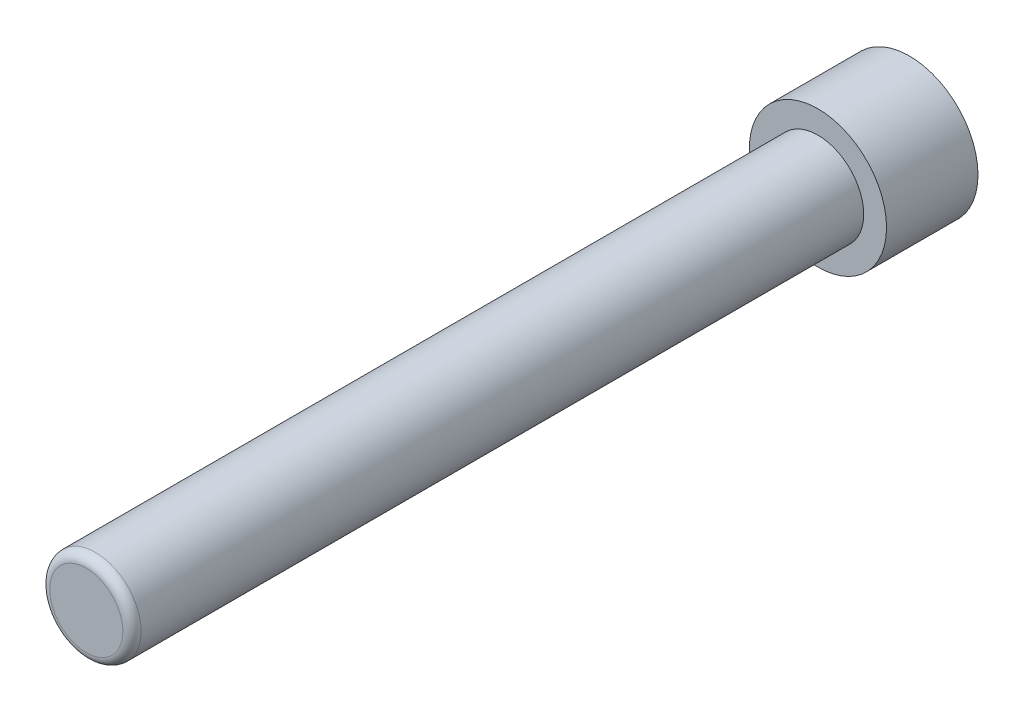
ISO-10303-21;
HEADER;
FILE_DESCRIPTION(('STEP AP214'),'2;1');
FILE_NAME('part.step','',(''),(''),'','','');
FILE_SCHEMA(('AUTOMOTIVE_DESIGN { 1 0 10303 214 1 1 1 1 }'));
ENDSEC;
DATA;
#1=APPLICATION_CONTEXT('core data for automotive mechanical design processes');
#2=APPLICATION_PROTOCOL_DEFINITION('international standard','automotive_design',2000,#1);
#3=PRODUCT_CONTEXT('',#1,'mechanical');
#4=PRODUCT('Part','Part','',(#3));
#5=PRODUCT_RELATED_PRODUCT_CATEGORY('part','',(#4));
#6=PRODUCT_DEFINITION_FORMATION('','',#4);
#7=PRODUCT_DEFINITION_CONTEXT('part definition',#1,'design');
#8=PRODUCT_DEFINITION('design','',#6,#7);
#9=PRODUCT_DEFINITION_SHAPE('','',#8);
#10=(LENGTH_UNIT() NAMED_UNIT(*) SI_UNIT(.MILLI.,.METRE.));
#11=(NAMED_UNIT(*) PLANE_ANGLE_UNIT() SI_UNIT($,.RADIAN.));
#12=(NAMED_UNIT(*) SI_UNIT($,.STERADIAN.) SOLID_ANGLE_UNIT());
#13=UNCERTAINTY_MEASURE_WITH_UNIT(LENGTH_MEASURE(1.E-05),#10,'distance_accuracy_value','');
#14=(GEOMETRIC_REPRESENTATION_CONTEXT(3) GLOBAL_UNCERTAINTY_ASSIGNED_CONTEXT((#13)) GLOBAL_UNIT_ASSIGNED_CONTEXT((#10,
#11,#12)) REPRESENTATION_CONTEXT('',''));
#15=CARTESIAN_POINT('',(0.,0.,0.));
#16=DIRECTION('',(0.,0.,1.));
#17=DIRECTION('',(1.,0.,0.));
#18=AXIS2_PLACEMENT_3D('',#15,#16,#17);
#19=CARTESIAN_POINT('',(0.,0.,25.4));
#20=DIRECTION('',(0.,0.,-1.));
#21=DIRECTION('',(-1.,0.,0.));
#22=AXIS2_PLACEMENT_3D('',#19,#20,#21);
#23=CYLINDRICAL_SURFACE('',#22,19.05);
#24=CARTESIAN_POINT('',(0.,0.,25.4));
#25=DIRECTION('',(0.,0.,1.));
#26=DIRECTION('',(1.,0.,0.));
#27=AXIS2_PLACEMENT_3D('',#24,#25,#26);
#28=CIRCLE('',#27,19.05);
#29=CARTESIAN_POINT('',(19.05,0.,25.4));
#30=VERTEX_POINT('',#29);
#31=EDGE_CURVE('E42',#30,#30,#28,.T.);
#32=ORIENTED_EDGE('',*,*,#31,.F.);
#33=EDGE_LOOP('',(#32));
#34=FACE_BOUND('',#33,.T.);
#35=CARTESIAN_POINT('',(0.,0.,0.));
#36=DIRECTION('',(0.,0.,1.));
#37=DIRECTION('',(1.,0.,0.));
#38=AXIS2_PLACEMENT_3D('',#35,#36,#37);
#39=CIRCLE('',#38,19.05);
#40=CARTESIAN_POINT('',(19.05,0.,0.));
#41=VERTEX_POINT('',#40);
#42=EDGE_CURVE('E46',#41,#41,#39,.T.);
#43=ORIENTED_EDGE('',*,*,#42,.T.);
#44=EDGE_LOOP('',(#43));
#45=FACE_BOUND('',#44,.T.);
#46=ADVANCED_FACE('F31',(#34,#45),#23,.T.);
#47=CARTESIAN_POINT('',(0.,0.,25.4));
#48=DIRECTION('',(0.,0.,1.));
#49=DIRECTION('',(1.,0.,0.));
#50=AXIS2_PLACEMENT_3D('',#47,#48,#49);
#51=PLANE('',#50);
#52=CARTESIAN_POINT('',(0.,0.,25.4));
#53=DIRECTION('',(0.,0.,1.));
#54=DIRECTION('',(1.,0.,0.));
#55=AXIS2_PLACEMENT_3D('',#52,#53,#54);
#56=CIRCLE('',#55,12.7);
#57=CARTESIAN_POINT('',(12.7,0.,25.4));
#58=VERTEX_POINT('',#57);
#59=EDGE_CURVE('E50',#58,#58,#56,.T.);
#60=ORIENTED_EDGE('',*,*,#59,.F.);
#61=EDGE_LOOP('',(#60));
#62=FACE_BOUND('',#61,.T.);
#63=ORIENTED_EDGE('',*,*,#31,.T.);
#64=EDGE_LOOP('',(#63));
#65=FACE_BOUND('',#64,.T.);
#66=ADVANCED_FACE('F57',(#62,#65),#51,.T.);
#67=CARTESIAN_POINT('',(0.,0.,0.));
#68=DIRECTION('',(0.,0.,1.));
#69=DIRECTION('',(1.,0.,0.));
#70=AXIS2_PLACEMENT_3D('',#67,#68,#69);
#71=PLANE('',#70);
#72=ORIENTED_EDGE('',*,*,#42,.F.);
#73=EDGE_LOOP('',(#72));
#74=FACE_BOUND('',#73,.T.);
#75=ADVANCED_FACE('F60',(#74),#71,.F.);
#76=CARTESIAN_POINT('',(0.,0.,228.6));
#77=DIRECTION('',(0.,0.,-1.));
#78=DIRECTION('',(-1.,0.,0.));
#79=AXIS2_PLACEMENT_3D('',#76,#77,#78);
#80=CYLINDRICAL_SURFACE('',#79,12.7);
#81=CARTESIAN_POINT('',(0.,0.,226.06));
#82=DIRECTION('',(0.,0.,1.));
#83=DIRECTION('',(1.,0.,0.));
#84=AXIS2_PLACEMENT_3D('',#81,#82,#83);
#85=CIRCLE('',#84,12.7);
#86=CARTESIAN_POINT('',(12.7,0.,226.06));
#87=VERTEX_POINT('',#86);
#88=EDGE_CURVE('E10',#87,#87,#85,.F.);
#89=ORIENTED_EDGE('',*,*,#88,.T.);
#90=EDGE_LOOP('',(#89));
#91=FACE_BOUND('',#90,.T.);
#92=ORIENTED_EDGE('',*,*,#59,.T.);
#93=EDGE_LOOP('',(#92));
#94=FACE_BOUND('',#93,.T.);
#95=ADVANCED_FACE('F55',(#91,#94),#80,.T.);
#96=CARTESIAN_POINT('',(0.,0.,228.6));
#97=DIRECTION('',(0.,0.,1.));
#98=DIRECTION('',(1.,0.,0.));
#99=AXIS2_PLACEMENT_3D('',#96,#97,#98);
#100=PLANE('',#99);
#101=CARTESIAN_POINT('',(0.,0.,228.6));
#102=DIRECTION('',(0.,0.,1.));
#103=DIRECTION('',(1.,0.,0.));
#104=AXIS2_PLACEMENT_3D('',#101,#102,#103);
#105=CIRCLE('',#104,10.16);
#106=CARTESIAN_POINT('',(10.16,0.,228.6));
#107=VERTEX_POINT('',#106);
#108=EDGE_CURVE('E38',#107,#107,#105,.T.);
#109=ORIENTED_EDGE('',*,*,#108,.T.);
#110=EDGE_LOOP('',(#109));
#111=FACE_BOUND('',#110,.T.);
#112=ADVANCED_FACE('F73',(#111),#100,.T.);
#113=CARTESIAN_POINT('',(0.,0.,226.06));
#114=DIRECTION('',(0.,0.,1.));
#115=DIRECTION('',(1.,0.,0.));
#116=AXIS2_PLACEMENT_3D('',#113,#114,#115);
#117=TOROIDAL_SURFACE('',#116,10.16,2.54);
#118=ORIENTED_EDGE('',*,*,#88,.F.);
#119=EDGE_LOOP('',(#118));
#120=FACE_BOUND('',#119,.T.);
#121=ORIENTED_EDGE('',*,*,#108,.F.);
#122=EDGE_LOOP('',(#121));
#123=FACE_BOUND('',#122,.T.);
#124=ADVANCED_FACE('F33',(#120,#123),#117,.T.);
#125=CLOSED_SHELL('',(#46,#66,#75,#95,#112,#124));
#126=MANIFOLD_SOLID_BREP('B2',#125);
#127=ADVANCED_BREP_SHAPE_REPRESENTATION('',(#18,#126),#14);
#128=SHAPE_DEFINITION_REPRESENTATION(#9,#127);
ENDSEC;
END-ISO-10303-21;
